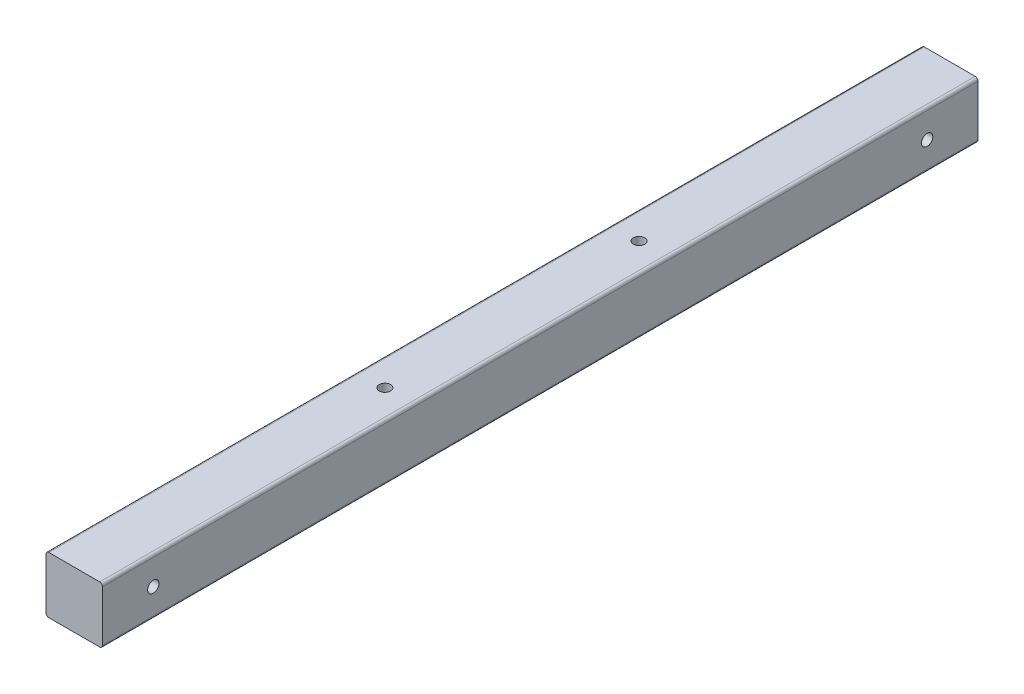
ISO-10303-21;
HEADER;
FILE_DESCRIPTION(('STEP AP214'),'2;1');
FILE_NAME('part.step','',(''),(''),'','','');
FILE_SCHEMA(('AUTOMOTIVE_DESIGN { 1 0 10303 214 1 1 1 1 }'));
ENDSEC;
DATA;
#1=APPLICATION_CONTEXT('core data for automotive mechanical design processes');
#2=APPLICATION_PROTOCOL_DEFINITION('international standard','automotive_design',2000,#1);
#3=PRODUCT_CONTEXT('',#1,'mechanical');
#4=PRODUCT('Part','Part','',(#3));
#5=PRODUCT_RELATED_PRODUCT_CATEGORY('part','',(#4));
#6=PRODUCT_DEFINITION_FORMATION('','',#4);
#7=PRODUCT_DEFINITION_CONTEXT('part definition',#1,'design');
#8=PRODUCT_DEFINITION('design','',#6,#7);
#9=PRODUCT_DEFINITION_SHAPE('','',#8);
#10=(LENGTH_UNIT() NAMED_UNIT(*) SI_UNIT(.MILLI.,.METRE.));
#11=(NAMED_UNIT(*) PLANE_ANGLE_UNIT() SI_UNIT($,.RADIAN.));
#12=(NAMED_UNIT(*) SI_UNIT($,.STERADIAN.) SOLID_ANGLE_UNIT());
#13=UNCERTAINTY_MEASURE_WITH_UNIT(LENGTH_MEASURE(1.E-05),#10,'distance_accuracy_value','');
#14=(GEOMETRIC_REPRESENTATION_CONTEXT(3) GLOBAL_UNCERTAINTY_ASSIGNED_CONTEXT((#13)) GLOBAL_UNIT_ASSIGNED_CONTEXT((#10,
#11,#12)) REPRESENTATION_CONTEXT('',''));
#15=CARTESIAN_POINT('',(0.,0.,0.));
#16=DIRECTION('',(0.,0.,1.));
#17=DIRECTION('',(1.,0.,0.));
#18=AXIS2_PLACEMENT_3D('',#15,#16,#17);
#19=CARTESIAN_POINT('',(0.,0.,310.));
#20=DIRECTION('',(1.,0.,0.));
#21=DIRECTION('',(0.,0.,-1.));
#22=AXIS2_PLACEMENT_3D('',#19,#20,#21);
#23=PLANE('',#22);
#24=CARTESIAN_POINT('',(0.,10.,18.));
#25=DIRECTION('',(-1.,0.,0.));
#26=DIRECTION('',(0.,0.,1.));
#27=AXIS2_PLACEMENT_3D('',#24,#25,#26);
#28=CIRCLE('',#27,2.);
#29=CARTESIAN_POINT('',(0.,10.,20.));
#30=VERTEX_POINT('',#29);
#31=EDGE_CURVE('E188',#30,#30,#28,.T.);
#32=ORIENTED_EDGE('',*,*,#31,.F.);
#33=EDGE_LOOP('',(#32));
#34=FACE_BOUND('',#33,.T.);
#35=CARTESIAN_POINT('',(0.,10.,292.));
#36=DIRECTION('',(-1.,0.,0.));
#37=DIRECTION('',(0.,0.,1.));
#38=AXIS2_PLACEMENT_3D('',#35,#36,#37);
#39=CIRCLE('',#38,2.);
#40=CARTESIAN_POINT('',(0.,10.,294.));
#41=VERTEX_POINT('',#40);
#42=EDGE_CURVE('E196',#41,#41,#39,.T.);
#43=ORIENTED_EDGE('',*,*,#42,.F.);
#44=EDGE_LOOP('',(#43));
#45=FACE_BOUND('',#44,.T.);
#46=DIRECTION('',(0.,-1.,0.));
#47=VECTOR('',#46,1.);
#48=CARTESIAN_POINT('',(0.,0.,0.));
#49=LINE('',#48,#47);
#50=CARTESIAN_POINT('',(0.,19.,0.));
#51=VERTEX_POINT('',#50);
#52=CARTESIAN_POINT('',(0.,1.,0.));
#53=VERTEX_POINT('',#52);
#54=EDGE_CURVE('E137',#51,#53,#49,.T.);
#55=ORIENTED_EDGE('',*,*,#54,.T.);
#56=DIRECTION('',(0.,0.,-1.));
#57=VECTOR('',#56,1.);
#58=CARTESIAN_POINT('',(0.,1.,310.));
#59=LINE('',#58,#57);
#60=CARTESIAN_POINT('',(0.,1.,310.));
#61=VERTEX_POINT('',#60);
#62=EDGE_CURVE('E112',#53,#61,#59,.F.);
#63=ORIENTED_EDGE('',*,*,#62,.T.);
#64=DIRECTION('',(0.,-1.,0.));
#65=VECTOR('',#64,1.);
#66=CARTESIAN_POINT('',(0.,0.,310.));
#67=LINE('',#66,#65);
#68=CARTESIAN_POINT('',(0.,19.,310.));
#69=VERTEX_POINT('',#68);
#70=EDGE_CURVE('E150',#69,#61,#67,.T.);
#71=ORIENTED_EDGE('',*,*,#70,.F.);
#72=DIRECTION('',(0.,0.,-1.));
#73=VECTOR('',#72,1.);
#74=CARTESIAN_POINT('',(0.,19.,310.));
#75=LINE('',#74,#73);
#76=EDGE_CURVE('E118',#69,#51,#75,.T.);
#77=ORIENTED_EDGE('',*,*,#76,.T.);
#78=EDGE_LOOP('',(#55,#63,#71,#77));
#79=FACE_BOUND('',#78,.T.);
#80=ADVANCED_FACE('F38',(#34,#45,#79),#23,.F.);
#81=CARTESIAN_POINT('',(0.,0.,310.));
#82=DIRECTION('',(0.,1.,0.));
#83=DIRECTION('',(0.,0.,1.));
#84=AXIS2_PLACEMENT_3D('',#81,#82,#83);
#85=PLANE('',#84);
#86=CARTESIAN_POINT('',(10.,0.,110.));
#87=DIRECTION('',(0.,1.,0.));
#88=DIRECTION('',(0.,0.,1.));
#89=AXIS2_PLACEMENT_3D('',#86,#87,#88);
#90=CIRCLE('',#89,2.);
#91=CARTESIAN_POINT('',(10.,0.,112.));
#92=VERTEX_POINT('',#91);
#93=EDGE_CURVE('E144',#92,#92,#90,.T.);
#94=ORIENTED_EDGE('',*,*,#93,.T.);
#95=EDGE_LOOP('',(#94));
#96=FACE_BOUND('',#95,.T.);
#97=CARTESIAN_POINT('',(10.,0.,200.));
#98=DIRECTION('',(0.,1.,0.));
#99=DIRECTION('',(0.,0.,1.));
#100=AXIS2_PLACEMENT_3D('',#97,#98,#99);
#101=CIRCLE('',#100,2.);
#102=CARTESIAN_POINT('',(10.,0.,202.));
#103=VERTEX_POINT('',#102);
#104=EDGE_CURVE('E208',#103,#103,#101,.T.);
#105=ORIENTED_EDGE('',*,*,#104,.T.);
#106=EDGE_LOOP('',(#105));
#107=FACE_BOUND('',#106,.T.);
#108=DIRECTION('',(1.,0.,0.));
#109=VECTOR('',#108,1.);
#110=CARTESIAN_POINT('',(0.,0.,310.));
#111=LINE('',#110,#109);
#112=CARTESIAN_POINT('',(1.,0.,310.));
#113=VERTEX_POINT('',#112);
#114=CARTESIAN_POINT('',(19.,0.,310.));
#115=VERTEX_POINT('',#114);
#116=EDGE_CURVE('E128',#113,#115,#111,.T.);
#117=ORIENTED_EDGE('',*,*,#116,.F.);
#118=DIRECTION('',(0.,0.,-1.));
#119=VECTOR('',#118,1.);
#120=CARTESIAN_POINT('',(1.,0.,310.));
#121=LINE('',#120,#119);
#122=CARTESIAN_POINT('',(1.,0.,0.));
#123=VERTEX_POINT('',#122);
#124=EDGE_CURVE('E111',#113,#123,#121,.T.);
#125=ORIENTED_EDGE('',*,*,#124,.T.);
#126=DIRECTION('',(1.,0.,0.));
#127=VECTOR('',#126,1.);
#128=CARTESIAN_POINT('',(0.,0.,0.));
#129=LINE('',#128,#127);
#130=CARTESIAN_POINT('',(19.,0.,0.));
#131=VERTEX_POINT('',#130);
#132=EDGE_CURVE('E125',#123,#131,#129,.T.);
#133=ORIENTED_EDGE('',*,*,#132,.T.);
#134=DIRECTION('',(0.,0.,-1.));
#135=VECTOR('',#134,1.);
#136=CARTESIAN_POINT('',(19.,0.,310.));
#137=LINE('',#136,#135);
#138=EDGE_CURVE('E131',#131,#115,#137,.F.);
#139=ORIENTED_EDGE('',*,*,#138,.T.);
#140=EDGE_LOOP('',(#117,#125,#133,#139));
#141=FACE_BOUND('',#140,.T.);
#142=ADVANCED_FACE('F124',(#96,#107,#141),#85,.F.);
#143=CARTESIAN_POINT('',(20.,0.,310.));
#144=DIRECTION('',(-1.,0.,0.));
#145=DIRECTION('',(0.,0.,1.));
#146=AXIS2_PLACEMENT_3D('',#143,#144,#145);
#147=PLANE('',#146);
#148=CARTESIAN_POINT('',(20.,10.,18.));
#149=DIRECTION('',(-1.,0.,0.));
#150=DIRECTION('',(0.,0.,1.));
#151=AXIS2_PLACEMENT_3D('',#148,#149,#150);
#152=CIRCLE('',#151,2.);
#153=CARTESIAN_POINT('',(20.,10.,20.));
#154=VERTEX_POINT('',#153);
#155=EDGE_CURVE('E42',#154,#154,#152,.T.);
#156=ORIENTED_EDGE('',*,*,#155,.T.);
#157=EDGE_LOOP('',(#156));
#158=FACE_BOUND('',#157,.T.);
#159=CARTESIAN_POINT('',(20.,10.,292.));
#160=DIRECTION('',(-1.,0.,0.));
#161=DIRECTION('',(0.,0.,1.));
#162=AXIS2_PLACEMENT_3D('',#159,#160,#161);
#163=CIRCLE('',#162,2.);
#164=CARTESIAN_POINT('',(20.,10.,294.));
#165=VERTEX_POINT('',#164);
#166=EDGE_CURVE('E185',#165,#165,#163,.T.);
#167=ORIENTED_EDGE('',*,*,#166,.T.);
#168=EDGE_LOOP('',(#167));
#169=FACE_BOUND('',#168,.T.);
#170=DIRECTION('',(0.,1.,0.));
#171=VECTOR('',#170,1.);
#172=CARTESIAN_POINT('',(20.,0.,310.));
#173=LINE('',#172,#171);
#174=CARTESIAN_POINT('',(20.,1.,310.));
#175=VERTEX_POINT('',#174);
#176=CARTESIAN_POINT('',(20.,19.,310.));
#177=VERTEX_POINT('',#176);
#178=EDGE_CURVE('E223',#175,#177,#173,.T.);
#179=ORIENTED_EDGE('',*,*,#178,.F.);
#180=DIRECTION('',(0.,0.,-1.));
#181=VECTOR('',#180,1.);
#182=CARTESIAN_POINT('',(20.,1.,310.));
#183=LINE('',#182,#181);
#184=CARTESIAN_POINT('',(20.,1.,0.));
#185=VERTEX_POINT('',#184);
#186=EDGE_CURVE('E180',#175,#185,#183,.T.);
#187=ORIENTED_EDGE('',*,*,#186,.T.);
#188=DIRECTION('',(0.,1.,0.));
#189=VECTOR('',#188,1.);
#190=CARTESIAN_POINT('',(20.,0.,0.));
#191=LINE('',#190,#189);
#192=CARTESIAN_POINT('',(20.,19.,0.));
#193=VERTEX_POINT('',#192);
#194=EDGE_CURVE('E136',#185,#193,#191,.T.);
#195=ORIENTED_EDGE('',*,*,#194,.T.);
#196=DIRECTION('',(0.,0.,-1.));
#197=VECTOR('',#196,1.);
#198=CARTESIAN_POINT('',(20.,19.,310.));
#199=LINE('',#198,#197);
#200=EDGE_CURVE('E177',#193,#177,#199,.F.);
#201=ORIENTED_EDGE('',*,*,#200,.T.);
#202=EDGE_LOOP('',(#179,#187,#195,#201));
#203=FACE_BOUND('',#202,.T.);
#204=ADVANCED_FACE('F240',(#158,#169,#203),#147,.F.);
#205=CARTESIAN_POINT('',(0.,20.,310.));
#206=DIRECTION('',(0.,-1.,0.));
#207=DIRECTION('',(0.,0.,-1.));
#208=AXIS2_PLACEMENT_3D('',#205,#206,#207);
#209=PLANE('',#208);
#210=CARTESIAN_POINT('',(10.,20.,110.));
#211=DIRECTION('',(0.,1.,0.));
#212=DIRECTION('',(0.,0.,1.));
#213=AXIS2_PLACEMENT_3D('',#210,#211,#212);
#214=CIRCLE('',#213,2.);
#215=CARTESIAN_POINT('',(10.,20.,112.));
#216=VERTEX_POINT('',#215);
#217=EDGE_CURVE('E204',#216,#216,#214,.T.);
#218=ORIENTED_EDGE('',*,*,#217,.F.);
#219=EDGE_LOOP('',(#218));
#220=FACE_BOUND('',#219,.T.);
#221=CARTESIAN_POINT('',(10.,20.,200.));
#222=DIRECTION('',(0.,1.,0.));
#223=DIRECTION('',(0.,0.,1.));
#224=AXIS2_PLACEMENT_3D('',#221,#222,#223);
#225=CIRCLE('',#224,2.);
#226=CARTESIAN_POINT('',(10.,20.,202.));
#227=VERTEX_POINT('',#226);
#228=EDGE_CURVE('E194',#227,#227,#225,.T.);
#229=ORIENTED_EDGE('',*,*,#228,.F.);
#230=EDGE_LOOP('',(#229));
#231=FACE_BOUND('',#230,.T.);
#232=DIRECTION('',(-1.,0.,0.));
#233=VECTOR('',#232,1.);
#234=CARTESIAN_POINT('',(0.,20.,310.));
#235=LINE('',#234,#233);
#236=CARTESIAN_POINT('',(19.,20.,310.));
#237=VERTEX_POINT('',#236);
#238=CARTESIAN_POINT('',(1.,20.,310.));
#239=VERTEX_POINT('',#238);
#240=EDGE_CURVE('E152',#237,#239,#235,.T.);
#241=ORIENTED_EDGE('',*,*,#240,.F.);
#242=DIRECTION('',(0.,0.,-1.));
#243=VECTOR('',#242,1.);
#244=CARTESIAN_POINT('',(19.,20.,310.));
#245=LINE('',#244,#243);
#246=CARTESIAN_POINT('',(19.,20.,0.));
#247=VERTEX_POINT('',#246);
#248=EDGE_CURVE('E11',#237,#247,#245,.T.);
#249=ORIENTED_EDGE('',*,*,#248,.T.);
#250=DIRECTION('',(-1.,0.,0.));
#251=VECTOR('',#250,1.);
#252=CARTESIAN_POINT('',(0.,20.,0.));
#253=LINE('',#252,#251);
#254=CARTESIAN_POINT('',(1.,20.,0.));
#255=VERTEX_POINT('',#254);
#256=EDGE_CURVE('E142',#247,#255,#253,.T.);
#257=ORIENTED_EDGE('',*,*,#256,.T.);
#258=DIRECTION('',(0.,0.,-1.));
#259=VECTOR('',#258,1.);
#260=CARTESIAN_POINT('',(1.,20.,310.));
#261=LINE('',#260,#259);
#262=EDGE_CURVE('E48',#255,#239,#261,.F.);
#263=ORIENTED_EDGE('',*,*,#262,.T.);
#264=EDGE_LOOP('',(#241,#249,#257,#263));
#265=FACE_BOUND('',#264,.T.);
#266=ADVANCED_FACE('F234',(#220,#231,#265),#209,.F.);
#267=CARTESIAN_POINT('',(0.,0.,310.));
#268=DIRECTION('',(0.,0.,-1.));
#269=DIRECTION('',(-1.,0.,0.));
#270=AXIS2_PLACEMENT_3D('',#267,#268,#269);
#271=PLANE('',#270);
#272=ORIENTED_EDGE('',*,*,#70,.T.);
#273=CARTESIAN_POINT('',(1.,1.,310.));
#274=DIRECTION('',(0.,0.,-1.));
#275=DIRECTION('',(-1.,0.,0.));
#276=AXIS2_PLACEMENT_3D('',#273,#274,#275);
#277=CIRCLE('',#276,1.);
#278=EDGE_CURVE('E174',#61,#113,#277,.F.);
#279=ORIENTED_EDGE('',*,*,#278,.T.);
#280=ORIENTED_EDGE('',*,*,#116,.T.);
#281=CARTESIAN_POINT('',(19.,1.,310.));
#282=DIRECTION('',(0.,0.,-1.));
#283=DIRECTION('',(-1.,0.,0.));
#284=AXIS2_PLACEMENT_3D('',#281,#282,#283);
#285=CIRCLE('',#284,1.);
#286=EDGE_CURVE('E171',#115,#175,#285,.F.);
#287=ORIENTED_EDGE('',*,*,#286,.T.);
#288=ORIENTED_EDGE('',*,*,#178,.T.);
#289=CARTESIAN_POINT('',(19.,19.,310.));
#290=DIRECTION('',(0.,0.,-1.));
#291=DIRECTION('',(-1.,0.,0.));
#292=AXIS2_PLACEMENT_3D('',#289,#290,#291);
#293=CIRCLE('',#292,1.);
#294=EDGE_CURVE('E62',#177,#237,#293,.F.);
#295=ORIENTED_EDGE('',*,*,#294,.T.);
#296=ORIENTED_EDGE('',*,*,#240,.T.);
#297=CARTESIAN_POINT('',(1.,19.,310.));
#298=DIRECTION('',(0.,0.,-1.));
#299=DIRECTION('',(-1.,0.,0.));
#300=AXIS2_PLACEMENT_3D('',#297,#298,#299);
#301=CIRCLE('',#300,1.);
#302=EDGE_CURVE('E166',#239,#69,#301,.F.);
#303=ORIENTED_EDGE('',*,*,#302,.T.);
#304=EDGE_LOOP('',(#272,#279,#280,#287,#288,#295,#296,#303));
#305=FACE_BOUND('',#304,.T.);
#306=ADVANCED_FACE('F227',(#305),#271,.F.);
#307=CARTESIAN_POINT('',(0.,0.,0.));
#308=DIRECTION('',(0.,0.,-1.));
#309=DIRECTION('',(-1.,0.,0.));
#310=AXIS2_PLACEMENT_3D('',#307,#308,#309);
#311=PLANE('',#310);
#312=ORIENTED_EDGE('',*,*,#132,.F.);
#313=CARTESIAN_POINT('',(1.,1.,0.));
#314=DIRECTION('',(0.,0.,-1.));
#315=DIRECTION('',(-1.,0.,0.));
#316=AXIS2_PLACEMENT_3D('',#313,#314,#315);
#317=CIRCLE('',#316,1.);
#318=EDGE_CURVE('E107',#123,#53,#317,.T.);
#319=ORIENTED_EDGE('',*,*,#318,.T.);
#320=ORIENTED_EDGE('',*,*,#54,.F.);
#321=CARTESIAN_POINT('',(1.,19.,0.));
#322=DIRECTION('',(0.,0.,-1.));
#323=DIRECTION('',(-1.,0.,0.));
#324=AXIS2_PLACEMENT_3D('',#321,#322,#323);
#325=CIRCLE('',#324,1.);
#326=EDGE_CURVE('E130',#51,#255,#325,.T.);
#327=ORIENTED_EDGE('',*,*,#326,.T.);
#328=ORIENTED_EDGE('',*,*,#256,.F.);
#329=CARTESIAN_POINT('',(19.,19.,0.));
#330=DIRECTION('',(0.,0.,-1.));
#331=DIRECTION('',(-1.,0.,0.));
#332=AXIS2_PLACEMENT_3D('',#329,#330,#331);
#333=CIRCLE('',#332,1.);
#334=EDGE_CURVE('E156',#247,#193,#333,.T.);
#335=ORIENTED_EDGE('',*,*,#334,.T.);
#336=ORIENTED_EDGE('',*,*,#194,.F.);
#337=CARTESIAN_POINT('',(19.,1.,0.));
#338=DIRECTION('',(0.,0.,-1.));
#339=DIRECTION('',(-1.,0.,0.));
#340=AXIS2_PLACEMENT_3D('',#337,#338,#339);
#341=CIRCLE('',#340,1.);
#342=EDGE_CURVE('E119',#185,#131,#341,.T.);
#343=ORIENTED_EDGE('',*,*,#342,.T.);
#344=EDGE_LOOP('',(#312,#319,#320,#327,#328,#335,#336,#343));
#345=FACE_BOUND('',#344,.T.);
#346=ADVANCED_FACE('F133',(#345),#311,.T.);
#347=CARTESIAN_POINT('',(1.,1.,310.));
#348=DIRECTION('',(0.,0.,-1.));
#349=DIRECTION('',(-1.,0.,0.));
#350=AXIS2_PLACEMENT_3D('',#347,#348,#349);
#351=CYLINDRICAL_SURFACE('',#350,1.);
#352=ORIENTED_EDGE('',*,*,#278,.F.);
#353=ORIENTED_EDGE('',*,*,#62,.F.);
#354=ORIENTED_EDGE('',*,*,#318,.F.);
#355=ORIENTED_EDGE('',*,*,#124,.F.);
#356=EDGE_LOOP('',(#352,#353,#354,#355));
#357=FACE_BOUND('',#356,.T.);
#358=ADVANCED_FACE('F110',(#357),#351,.T.);
#359=CARTESIAN_POINT('',(19.,1.,310.));
#360=DIRECTION('',(0.,0.,-1.));
#361=DIRECTION('',(-1.,0.,0.));
#362=AXIS2_PLACEMENT_3D('',#359,#360,#361);
#363=CYLINDRICAL_SURFACE('',#362,1.);
#364=ORIENTED_EDGE('',*,*,#286,.F.);
#365=ORIENTED_EDGE('',*,*,#138,.F.);
#366=ORIENTED_EDGE('',*,*,#342,.F.);
#367=ORIENTED_EDGE('',*,*,#186,.F.);
#368=EDGE_LOOP('',(#364,#365,#366,#367));
#369=FACE_BOUND('',#368,.T.);
#370=ADVANCED_FACE('F244',(#369),#363,.T.);
#371=CARTESIAN_POINT('',(19.,19.,310.));
#372=DIRECTION('',(0.,0.,-1.));
#373=DIRECTION('',(-1.,0.,0.));
#374=AXIS2_PLACEMENT_3D('',#371,#372,#373);
#375=CYLINDRICAL_SURFACE('',#374,1.);
#376=ORIENTED_EDGE('',*,*,#294,.F.);
#377=ORIENTED_EDGE('',*,*,#200,.F.);
#378=ORIENTED_EDGE('',*,*,#334,.F.);
#379=ORIENTED_EDGE('',*,*,#248,.F.);
#380=EDGE_LOOP('',(#376,#377,#378,#379));
#381=FACE_BOUND('',#380,.T.);
#382=ADVANCED_FACE('F236',(#381),#375,.T.);
#383=CARTESIAN_POINT('',(1.,19.,310.));
#384=DIRECTION('',(0.,0.,-1.));
#385=DIRECTION('',(-1.,0.,0.));
#386=AXIS2_PLACEMENT_3D('',#383,#384,#385);
#387=CYLINDRICAL_SURFACE('',#386,1.);
#388=ORIENTED_EDGE('',*,*,#302,.F.);
#389=ORIENTED_EDGE('',*,*,#262,.F.);
#390=ORIENTED_EDGE('',*,*,#326,.F.);
#391=ORIENTED_EDGE('',*,*,#76,.F.);
#392=EDGE_LOOP('',(#388,#389,#390,#391));
#393=FACE_BOUND('',#392,.T.);
#394=ADVANCED_FACE('F40',(#393),#387,.T.);
#395=CARTESIAN_POINT('',(10.,-290.,200.));
#396=DIRECTION('',(0.,1.,0.));
#397=DIRECTION('',(0.,0.,1.));
#398=AXIS2_PLACEMENT_3D('',#395,#396,#397);
#399=CYLINDRICAL_SURFACE('',#398,2.);
#400=ORIENTED_EDGE('',*,*,#228,.T.);
#401=EDGE_LOOP('',(#400));
#402=FACE_BOUND('',#401,.T.);
#403=ORIENTED_EDGE('',*,*,#104,.F.);
#404=EDGE_LOOP('',(#403));
#405=FACE_BOUND('',#404,.T.);
#406=ADVANCED_FACE('F273',(#402,#405),#399,.F.);
#407=CARTESIAN_POINT('',(10.,-290.,110.));
#408=DIRECTION('',(0.,1.,0.));
#409=DIRECTION('',(0.,0.,1.));
#410=AXIS2_PLACEMENT_3D('',#407,#408,#409);
#411=CYLINDRICAL_SURFACE('',#410,2.);
#412=ORIENTED_EDGE('',*,*,#217,.T.);
#413=EDGE_LOOP('',(#412));
#414=FACE_BOUND('',#413,.T.);
#415=ORIENTED_EDGE('',*,*,#93,.F.);
#416=EDGE_LOOP('',(#415));
#417=FACE_BOUND('',#416,.T.);
#418=ADVANCED_FACE('F276',(#414,#417),#411,.F.);
#419=CARTESIAN_POINT('',(310.,10.,292.));
#420=DIRECTION('',(-1.,0.,0.));
#421=DIRECTION('',(0.,0.,1.));
#422=AXIS2_PLACEMENT_3D('',#419,#420,#421);
#423=CYLINDRICAL_SURFACE('',#422,2.);
#424=ORIENTED_EDGE('',*,*,#42,.T.);
#425=EDGE_LOOP('',(#424));
#426=FACE_BOUND('',#425,.T.);
#427=ORIENTED_EDGE('',*,*,#166,.F.);
#428=EDGE_LOOP('',(#427));
#429=FACE_BOUND('',#428,.T.);
#430=ADVANCED_FACE('F280',(#426,#429),#423,.F.);
#431=CARTESIAN_POINT('',(310.,10.,18.));
#432=DIRECTION('',(-1.,0.,0.));
#433=DIRECTION('',(0.,0.,1.));
#434=AXIS2_PLACEMENT_3D('',#431,#432,#433);
#435=CYLINDRICAL_SURFACE('',#434,2.);
#436=ORIENTED_EDGE('',*,*,#31,.T.);
#437=EDGE_LOOP('',(#436));
#438=FACE_BOUND('',#437,.T.);
#439=ORIENTED_EDGE('',*,*,#155,.F.);
#440=EDGE_LOOP('',(#439));
#441=FACE_BOUND('',#440,.T.);
#442=ADVANCED_FACE('F284',(#438,#441),#435,.F.);
#443=CLOSED_SHELL('',(#80,#142,#204,#266,#306,#346,#358,#370,#382,#394,#406,#418,#430,#442));
#444=MANIFOLD_SOLID_BREP('B2',#443);
#445=ADVANCED_BREP_SHAPE_REPRESENTATION('',(#18,#444),#14);
#446=SHAPE_DEFINITION_REPRESENTATION(#9,#445);
ENDSEC;
END-ISO-10303-21;
